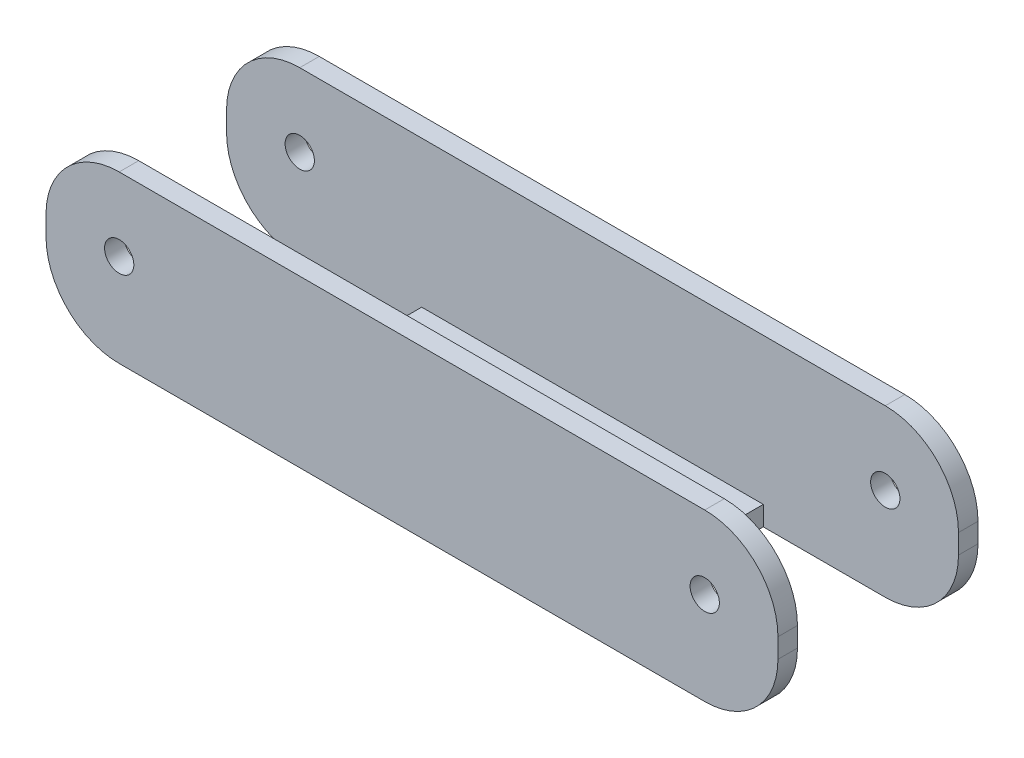
ISO-10303-21;
HEADER;
FILE_DESCRIPTION(('STEP AP214'),'2;1');
FILE_NAME('part.step','',(''),(''),'','','');
FILE_SCHEMA(('AUTOMOTIVE_DESIGN { 1 0 10303 214 1 1 1 1 }'));
ENDSEC;
DATA;
#1=APPLICATION_CONTEXT('core data for automotive mechanical design processes');
#2=APPLICATION_PROTOCOL_DEFINITION('international standard','automotive_design',2000,#1);
#3=PRODUCT_CONTEXT('',#1,'mechanical');
#4=PRODUCT('Part','Part','',(#3));
#5=PRODUCT_RELATED_PRODUCT_CATEGORY('part','',(#4));
#6=PRODUCT_DEFINITION_FORMATION('','',#4);
#7=PRODUCT_DEFINITION_CONTEXT('part definition',#1,'design');
#8=PRODUCT_DEFINITION('design','',#6,#7);
#9=PRODUCT_DEFINITION_SHAPE('','',#8);
#10=(LENGTH_UNIT() NAMED_UNIT(*) SI_UNIT(.MILLI.,.METRE.));
#11=(NAMED_UNIT(*) PLANE_ANGLE_UNIT() SI_UNIT($,.RADIAN.));
#12=(NAMED_UNIT(*) SI_UNIT($,.STERADIAN.) SOLID_ANGLE_UNIT());
#13=UNCERTAINTY_MEASURE_WITH_UNIT(LENGTH_MEASURE(1.E-05),#10,'distance_accuracy_value','');
#14=(GEOMETRIC_REPRESENTATION_CONTEXT(3) GLOBAL_UNCERTAINTY_ASSIGNED_CONTEXT((#13)) GLOBAL_UNIT_ASSIGNED_CONTEXT((#10,
#11,#12)) REPRESENTATION_CONTEXT('',''));
#15=CARTESIAN_POINT('',(0.,0.,0.));
#16=DIRECTION('',(0.,0.,1.));
#17=DIRECTION('',(1.,0.,0.));
#18=AXIS2_PLACEMENT_3D('',#15,#16,#17);
#19=CARTESIAN_POINT('',(0.,0.,0.));
#20=DIRECTION('',(1.,0.,0.));
#21=DIRECTION('',(0.,0.,-1.));
#22=AXIS2_PLACEMENT_3D('',#19,#20,#21);
#23=PLANE('',#22);
#24=DIRECTION('',(0.,-1.,0.));
#25=VECTOR('',#24,1.);
#26=CARTESIAN_POINT('',(0.,0.,-20.5));
#27=LINE('',#26,#25);
#28=CARTESIAN_POINT('',(0.,19.,-20.5));
#29=VERTEX_POINT('',#28);
#30=CARTESIAN_POINT('',(0.,15.,-20.5));
#31=VERTEX_POINT('',#30);
#32=EDGE_CURVE('E267',#29,#31,#27,.T.);
#33=ORIENTED_EDGE('',*,*,#32,.T.);
#34=DIRECTION('',(0.,0.,-1.));
#35=VECTOR('',#34,1.);
#36=CARTESIAN_POINT('',(0.,15.,0.));
#37=LINE('',#36,#35);
#38=CARTESIAN_POINT('',(0.,15.,-16.5));
#39=VERTEX_POINT('',#38);
#40=EDGE_CURVE('E356',#31,#39,#37,.F.);
#41=ORIENTED_EDGE('',*,*,#40,.T.);
#42=DIRECTION('',(0.,1.,0.));
#43=VECTOR('',#42,1.);
#44=CARTESIAN_POINT('',(0.,0.,-16.5));
#45=LINE('',#44,#43);
#46=CARTESIAN_POINT('',(0.,19.,-16.5));
#47=VERTEX_POINT('',#46);
#48=EDGE_CURVE('E253',#39,#47,#45,.T.);
#49=ORIENTED_EDGE('',*,*,#48,.T.);
#50=DIRECTION('',(0.,0.,-1.));
#51=VECTOR('',#50,1.);
#52=CARTESIAN_POINT('',(0.,19.,-20.5));
#53=LINE('',#52,#51);
#54=EDGE_CURVE('E353',#47,#29,#53,.T.);
#55=ORIENTED_EDGE('',*,*,#54,.T.);
#56=EDGE_LOOP('',(#33,#41,#49,#55));
#57=FACE_BOUND('',#56,.T.);
#58=ADVANCED_FACE('F39',(#57),#23,.F.);
#59=CARTESIAN_POINT('',(150.,0.,0.));
#60=DIRECTION('',(1.,0.,0.));
#61=DIRECTION('',(0.,0.,-1.));
#62=AXIS2_PLACEMENT_3D('',#59,#60,#61);
#63=PLANE('',#62);
#64=DIRECTION('',(0.,-1.,0.));
#65=VECTOR('',#64,1.);
#66=CARTESIAN_POINT('',(150.,0.,20.5));
#67=LINE('',#66,#65);
#68=CARTESIAN_POINT('',(150.,19.,20.5));
#69=VERTEX_POINT('',#68);
#70=CARTESIAN_POINT('',(150.,15.,20.5));
#71=VERTEX_POINT('',#70);
#72=EDGE_CURVE('E252',#69,#71,#67,.T.);
#73=ORIENTED_EDGE('',*,*,#72,.T.);
#74=DIRECTION('',(0.,0.,-1.));
#75=VECTOR('',#74,1.);
#76=CARTESIAN_POINT('',(150.,15.,16.5));
#77=LINE('',#76,#75);
#78=CARTESIAN_POINT('',(150.,15.,16.5));
#79=VERTEX_POINT('',#78);
#80=EDGE_CURVE('E297',#71,#79,#77,.T.);
#81=ORIENTED_EDGE('',*,*,#80,.T.);
#82=DIRECTION('',(0.,1.,0.));
#83=VECTOR('',#82,1.);
#84=CARTESIAN_POINT('',(150.,0.,16.5));
#85=LINE('',#84,#83);
#86=CARTESIAN_POINT('',(150.,19.,16.5));
#87=VERTEX_POINT('',#86);
#88=EDGE_CURVE('E249',#79,#87,#85,.T.);
#89=ORIENTED_EDGE('',*,*,#88,.T.);
#90=DIRECTION('',(0.,0.,1.));
#91=VECTOR('',#90,1.);
#92=CARTESIAN_POINT('',(150.,19.,20.5));
#93=LINE('',#92,#91);
#94=EDGE_CURVE('E290',#87,#69,#93,.T.);
#95=ORIENTED_EDGE('',*,*,#94,.T.);
#96=EDGE_LOOP('',(#73,#81,#89,#95));
#97=FACE_BOUND('',#96,.T.);
#98=ADVANCED_FACE('F380',(#97),#63,.T.);
#99=CARTESIAN_POINT('',(150.,4.,0.));
#100=DIRECTION('',(0.,-1.,0.));
#101=DIRECTION('',(0.,0.,-1.));
#102=AXIS2_PLACEMENT_3D('',#99,#100,#101);
#103=PLANE('',#102);
#104=DIRECTION('',(-1.,0.,0.));
#105=VECTOR('',#104,1.);
#106=CARTESIAN_POINT('',(150.,4.,-16.5));
#107=LINE('',#106,#105);
#108=CARTESIAN_POINT('',(110.,4.,-16.5));
#109=VERTEX_POINT('',#108);
#110=CARTESIAN_POINT('',(40.,4.,-16.5));
#111=VERTEX_POINT('',#110);
#112=EDGE_CURVE('E261',#109,#111,#107,.T.);
#113=ORIENTED_EDGE('',*,*,#112,.T.);
#114=DIRECTION('',(0.,0.,1.));
#115=VECTOR('',#114,1.);
#116=CARTESIAN_POINT('',(40.,4.,0.));
#117=LINE('',#116,#115);
#118=CARTESIAN_POINT('',(40.,3.99999999999999,16.5));
#119=VERTEX_POINT('',#118);
#120=EDGE_CURVE('E209',#111,#119,#117,.T.);
#121=ORIENTED_EDGE('',*,*,#120,.T.);
#122=DIRECTION('',(-1.,0.,0.));
#123=VECTOR('',#122,1.);
#124=CARTESIAN_POINT('',(150.,3.99999999999999,16.5));
#125=LINE('',#124,#123);
#126=CARTESIAN_POINT('',(110.,3.99999999999999,16.5));
#127=VERTEX_POINT('',#126);
#128=EDGE_CURVE('E186',#127,#119,#125,.T.);
#129=ORIENTED_EDGE('',*,*,#128,.F.);
#130=DIRECTION('',(0.,0.,-1.));
#131=VECTOR('',#130,1.);
#132=CARTESIAN_POINT('',(110.,4.,0.));
#133=LINE('',#132,#131);
#134=EDGE_CURVE('E223',#127,#109,#133,.T.);
#135=ORIENTED_EDGE('',*,*,#134,.T.);
#136=EDGE_LOOP('',(#113,#121,#129,#135));
#137=FACE_BOUND('',#136,.T.);
#138=ADVANCED_FACE('F408',(#137),#103,.F.);
#139=CARTESIAN_POINT('',(150.,0.,16.5));
#140=DIRECTION('',(0.,0.,1.));
#141=DIRECTION('',(0.,-1.,0.));
#142=AXIS2_PLACEMENT_3D('',#139,#140,#141);
#143=PLANE('',#142);
#144=ORIENTED_EDGE('',*,*,#88,.F.);
#145=CARTESIAN_POINT('',(135.,15.,16.5));
#146=DIRECTION('',(0.,0.,1.));
#147=DIRECTION('',(0.,-1.,0.));
#148=AXIS2_PLACEMENT_3D('',#145,#146,#147);
#149=CIRCLE('',#148,15.);
#150=CARTESIAN_POINT('',(135.,0.,16.5));
#151=VERTEX_POINT('',#150);
#152=EDGE_CURVE('E306',#79,#151,#149,.F.);
#153=ORIENTED_EDGE('',*,*,#152,.T.);
#154=DIRECTION('',(-1.,0.,0.));
#155=VECTOR('',#154,1.);
#156=CARTESIAN_POINT('',(110.,0.,16.5));
#157=LINE('',#156,#155);
#158=CARTESIAN_POINT('',(110.,0.,16.5));
#159=VERTEX_POINT('',#158);
#160=EDGE_CURVE('E212',#151,#159,#157,.T.);
#161=ORIENTED_EDGE('',*,*,#160,.T.);
#162=DIRECTION('',(0.,-1.,0.));
#163=VECTOR('',#162,1.);
#164=CARTESIAN_POINT('',(110.,10.,16.5));
#165=LINE('',#164,#163);
#166=EDGE_CURVE('E220',#127,#159,#165,.T.);
#167=ORIENTED_EDGE('',*,*,#166,.F.);
#168=ORIENTED_EDGE('',*,*,#128,.T.);
#169=DIRECTION('',(0.,-1.,0.));
#170=VECTOR('',#169,1.);
#171=CARTESIAN_POINT('',(40.,10.,16.5));
#172=LINE('',#171,#170);
#173=CARTESIAN_POINT('',(40.,0.,16.5));
#174=VERTEX_POINT('',#173);
#175=EDGE_CURVE('E177',#119,#174,#172,.T.);
#176=ORIENTED_EDGE('',*,*,#175,.T.);
#177=DIRECTION('',(-1.,0.,0.));
#178=VECTOR('',#177,1.);
#179=CARTESIAN_POINT('',(40.,0.,16.5));
#180=LINE('',#179,#178);
#181=CARTESIAN_POINT('',(15.,0.,16.5));
#182=VERTEX_POINT('',#181);
#183=EDGE_CURVE('E183',#174,#182,#180,.T.);
#184=ORIENTED_EDGE('',*,*,#183,.T.);
#185=CARTESIAN_POINT('',(15.,15.,16.5));
#186=DIRECTION('',(0.,0.,1.));
#187=DIRECTION('',(0.,-1.,0.));
#188=AXIS2_PLACEMENT_3D('',#185,#186,#187);
#189=CIRCLE('',#188,15.);
#190=CARTESIAN_POINT('',(0.,15.,16.5));
#191=VERTEX_POINT('',#190);
#192=EDGE_CURVE('E302',#182,#191,#189,.F.);
#193=ORIENTED_EDGE('',*,*,#192,.T.);
#194=DIRECTION('',(0.,1.,0.));
#195=VECTOR('',#194,1.);
#196=CARTESIAN_POINT('',(0.,0.,16.5));
#197=LINE('',#196,#195);
#198=CARTESIAN_POINT('',(0.,19.,16.5));
#199=VERTEX_POINT('',#198);
#200=EDGE_CURVE('E248',#191,#199,#197,.T.);
#201=ORIENTED_EDGE('',*,*,#200,.T.);
#202=CARTESIAN_POINT('',(15.,19.,16.5));
#203=DIRECTION('',(0.,0.,1.));
#204=DIRECTION('',(0.,-1.,0.));
#205=AXIS2_PLACEMENT_3D('',#202,#203,#204);
#206=CIRCLE('',#205,15.);
#207=CARTESIAN_POINT('',(15.,34.,16.5));
#208=VERTEX_POINT('',#207);
#209=EDGE_CURVE('E300',#199,#208,#206,.F.);
#210=ORIENTED_EDGE('',*,*,#209,.T.);
#211=DIRECTION('',(-1.,0.,0.));
#212=VECTOR('',#211,1.);
#213=CARTESIAN_POINT('',(150.,34.,16.5));
#214=LINE('',#213,#212);
#215=CARTESIAN_POINT('',(135.,34.,16.5));
#216=VERTEX_POINT('',#215);
#217=EDGE_CURVE('E286',#216,#208,#214,.T.);
#218=ORIENTED_EDGE('',*,*,#217,.F.);
#219=CARTESIAN_POINT('',(135.,19.,16.5));
#220=DIRECTION('',(0.,0.,1.));
#221=DIRECTION('',(0.,-1.,0.));
#222=AXIS2_PLACEMENT_3D('',#219,#220,#221);
#223=CIRCLE('',#222,15.);
#224=EDGE_CURVE('E304',#216,#87,#223,.F.);
#225=ORIENTED_EDGE('',*,*,#224,.T.);
#226=EDGE_LOOP('',(#144,#153,#161,#167,#168,#176,#184,#193,#201,#210,#218,#225));
#227=FACE_BOUND('',#226,.T.);
#228=CARTESIAN_POINT('',(135.,19.,16.5));
#229=DIRECTION('',(0.,0.,1.));
#230=DIRECTION('',(0.,-1.,0.));
#231=AXIS2_PLACEMENT_3D('',#228,#229,#230);
#232=CIRCLE('',#231,2.99999999999999);
#233=CARTESIAN_POINT('',(135.,16.,16.5));
#234=VERTEX_POINT('',#233);
#235=EDGE_CURVE('E235',#234,#234,#232,.T.);
#236=ORIENTED_EDGE('',*,*,#235,.T.);
#237=EDGE_LOOP('',(#236));
#238=FACE_BOUND('',#237,.T.);
#239=CARTESIAN_POINT('',(15.,19.,16.5));
#240=DIRECTION('',(0.,0.,1.));
#241=DIRECTION('',(0.,-1.,0.));
#242=AXIS2_PLACEMENT_3D('',#239,#240,#241);
#243=CIRCLE('',#242,2.99999999999999);
#244=CARTESIAN_POINT('',(15.,16.,16.5));
#245=VERTEX_POINT('',#244);
#246=EDGE_CURVE('E245',#245,#245,#243,.T.);
#247=ORIENTED_EDGE('',*,*,#246,.T.);
#248=EDGE_LOOP('',(#247));
#249=FACE_BOUND('',#248,.T.);
#250=ADVANCED_FACE('F180',(#227,#238,#249),#143,.F.);
#251=CARTESIAN_POINT('',(150.,34.,0.));
#252=DIRECTION('',(0.,-1.,0.));
#253=DIRECTION('',(0.,0.,-1.));
#254=AXIS2_PLACEMENT_3D('',#251,#252,#253);
#255=PLANE('',#254);
#256=DIRECTION('',(-1.,0.,0.));
#257=VECTOR('',#256,1.);
#258=CARTESIAN_POINT('',(150.,34.,20.5));
#259=LINE('',#258,#257);
#260=CARTESIAN_POINT('',(135.,34.,20.5));
#261=VERTEX_POINT('',#260);
#262=CARTESIAN_POINT('',(15.,34.,20.5));
#263=VERTEX_POINT('',#262);
#264=EDGE_CURVE('E283',#261,#263,#259,.T.);
#265=ORIENTED_EDGE('',*,*,#264,.F.);
#266=DIRECTION('',(0.,0.,1.));
#267=VECTOR('',#266,1.);
#268=CARTESIAN_POINT('',(135.,34.,16.5));
#269=LINE('',#268,#267);
#270=EDGE_CURVE('E351',#261,#216,#269,.F.);
#271=ORIENTED_EDGE('',*,*,#270,.T.);
#272=ORIENTED_EDGE('',*,*,#217,.T.);
#273=DIRECTION('',(0.,0.,1.));
#274=VECTOR('',#273,1.);
#275=CARTESIAN_POINT('',(15.,34.,0.));
#276=LINE('',#275,#274);
#277=EDGE_CURVE('E348',#208,#263,#276,.T.);
#278=ORIENTED_EDGE('',*,*,#277,.T.);
#279=EDGE_LOOP('',(#265,#271,#272,#278));
#280=FACE_BOUND('',#279,.T.);
#281=ADVANCED_FACE('F369',(#280),#255,.F.);
#282=CARTESIAN_POINT('',(150.,0.,20.5));
#283=DIRECTION('',(0.,0.,-1.));
#284=DIRECTION('',(0.,1.,0.));
#285=AXIS2_PLACEMENT_3D('',#282,#283,#284);
#286=PLANE('',#285);
#287=CARTESIAN_POINT('',(135.,19.,20.5));
#288=DIRECTION('',(0.,0.,1.));
#289=DIRECTION('',(-1.,0.,0.));
#290=AXIS2_PLACEMENT_3D('',#287,#288,#289);
#291=CIRCLE('',#290,2.99999999999999);
#292=CARTESIAN_POINT('',(132.,19.,20.5));
#293=VERTEX_POINT('',#292);
#294=EDGE_CURVE('E228',#293,#293,#291,.T.);
#295=ORIENTED_EDGE('',*,*,#294,.F.);
#296=EDGE_LOOP('',(#295));
#297=FACE_BOUND('',#296,.T.);
#298=CARTESIAN_POINT('',(15.,19.,20.5));
#299=DIRECTION('',(0.,0.,1.));
#300=DIRECTION('',(1.,0.,0.));
#301=AXIS2_PLACEMENT_3D('',#298,#299,#300);
#302=CIRCLE('',#301,2.99999999999999);
#303=CARTESIAN_POINT('',(18.,19.,20.5));
#304=VERTEX_POINT('',#303);
#305=EDGE_CURVE('E238',#304,#304,#302,.T.);
#306=ORIENTED_EDGE('',*,*,#305,.F.);
#307=EDGE_LOOP('',(#306));
#308=FACE_BOUND('',#307,.T.);
#309=DIRECTION('',(-1.,0.,0.));
#310=VECTOR('',#309,1.);
#311=CARTESIAN_POINT('',(150.,0.,20.5));
#312=LINE('',#311,#310);
#313=CARTESIAN_POINT('',(135.,0.,20.5));
#314=VERTEX_POINT('',#313);
#315=CARTESIAN_POINT('',(15.,0.,20.5));
#316=VERTEX_POINT('',#315);
#317=EDGE_CURVE('E281',#314,#316,#312,.T.);
#318=ORIENTED_EDGE('',*,*,#317,.F.);
#319=CARTESIAN_POINT('',(135.,15.,20.5));
#320=DIRECTION('',(0.,0.,-1.));
#321=DIRECTION('',(0.,1.,0.));
#322=AXIS2_PLACEMENT_3D('',#319,#320,#321);
#323=CIRCLE('',#322,15.);
#324=EDGE_CURVE('E322',#314,#71,#323,.F.);
#325=ORIENTED_EDGE('',*,*,#324,.T.);
#326=ORIENTED_EDGE('',*,*,#72,.F.);
#327=CARTESIAN_POINT('',(135.,19.,20.5));
#328=DIRECTION('',(0.,0.,-1.));
#329=DIRECTION('',(0.,1.,0.));
#330=AXIS2_PLACEMENT_3D('',#327,#328,#329);
#331=CIRCLE('',#330,15.);
#332=EDGE_CURVE('E320',#69,#261,#331,.F.);
#333=ORIENTED_EDGE('',*,*,#332,.T.);
#334=ORIENTED_EDGE('',*,*,#264,.T.);
#335=CARTESIAN_POINT('',(15.,19.,20.5));
#336=DIRECTION('',(0.,0.,-1.));
#337=DIRECTION('',(0.,1.,0.));
#338=AXIS2_PLACEMENT_3D('',#335,#336,#337);
#339=CIRCLE('',#338,15.);
#340=CARTESIAN_POINT('',(0.,19.,20.5));
#341=VERTEX_POINT('',#340);
#342=EDGE_CURVE('E316',#263,#341,#339,.F.);
#343=ORIENTED_EDGE('',*,*,#342,.T.);
#344=DIRECTION('',(0.,-1.,0.));
#345=VECTOR('',#344,1.);
#346=CARTESIAN_POINT('',(0.,0.,20.5));
#347=LINE('',#346,#345);
#348=CARTESIAN_POINT('',(0.,15.,20.5));
#349=VERTEX_POINT('',#348);
#350=EDGE_CURVE('E264',#341,#349,#347,.T.);
#351=ORIENTED_EDGE('',*,*,#350,.T.);
#352=CARTESIAN_POINT('',(15.,15.,20.5));
#353=DIRECTION('',(0.,0.,-1.));
#354=DIRECTION('',(0.,1.,0.));
#355=AXIS2_PLACEMENT_3D('',#352,#353,#354);
#356=CIRCLE('',#355,15.);
#357=EDGE_CURVE('E318',#349,#316,#356,.F.);
#358=ORIENTED_EDGE('',*,*,#357,.T.);
#359=EDGE_LOOP('',(#318,#325,#326,#333,#334,#343,#351,#358));
#360=FACE_BOUND('',#359,.T.);
#361=ADVANCED_FACE('F373',(#297,#308,#360),#286,.F.);
#362=CARTESIAN_POINT('',(150.,0.,0.));
#363=DIRECTION('',(0.,1.,0.));
#364=DIRECTION('',(0.,0.,1.));
#365=AXIS2_PLACEMENT_3D('',#362,#363,#364);
#366=PLANE('',#365);
#367=ORIENTED_EDGE('',*,*,#160,.F.);
#368=DIRECTION('',(0.,0.,-1.));
#369=VECTOR('',#368,1.);
#370=CARTESIAN_POINT('',(135.,0.,20.5));
#371=LINE('',#370,#369);
#372=EDGE_CURVE('E314',#151,#314,#371,.F.);
#373=ORIENTED_EDGE('',*,*,#372,.T.);
#374=ORIENTED_EDGE('',*,*,#317,.T.);
#375=DIRECTION('',(0.,0.,-1.));
#376=VECTOR('',#375,1.);
#377=CARTESIAN_POINT('',(15.,0.,0.));
#378=LINE('',#377,#376);
#379=EDGE_CURVE('E205',#316,#182,#378,.T.);
#380=ORIENTED_EDGE('',*,*,#379,.T.);
#381=ORIENTED_EDGE('',*,*,#183,.F.);
#382=DIRECTION('',(0.,0.,1.));
#383=VECTOR('',#382,1.);
#384=CARTESIAN_POINT('',(40.,0.,-16.5));
#385=LINE('',#384,#383);
#386=CARTESIAN_POINT('',(40.,0.,-16.5));
#387=VERTEX_POINT('',#386);
#388=EDGE_CURVE('E194',#387,#174,#385,.T.);
#389=ORIENTED_EDGE('',*,*,#388,.F.);
#390=DIRECTION('',(1.,0.,0.));
#391=VECTOR('',#390,1.);
#392=CARTESIAN_POINT('',(0.,0.,-16.5));
#393=LINE('',#392,#391);
#394=CARTESIAN_POINT('',(15.,0.,-16.5));
#395=VERTEX_POINT('',#394);
#396=EDGE_CURVE('E190',#395,#387,#393,.T.);
#397=ORIENTED_EDGE('',*,*,#396,.F.);
#398=DIRECTION('',(0.,0.,-1.));
#399=VECTOR('',#398,1.);
#400=CARTESIAN_POINT('',(15.,0.,0.));
#401=LINE('',#400,#399);
#402=CARTESIAN_POINT('',(15.,0.,-20.5));
#403=VERTEX_POINT('',#402);
#404=EDGE_CURVE('E309',#395,#403,#401,.T.);
#405=ORIENTED_EDGE('',*,*,#404,.T.);
#406=DIRECTION('',(-1.,0.,0.));
#407=VECTOR('',#406,1.);
#408=CARTESIAN_POINT('',(150.,0.,-20.5));
#409=LINE('',#408,#407);
#410=CARTESIAN_POINT('',(135.,0.,-20.5));
#411=VERTEX_POINT('',#410);
#412=EDGE_CURVE('E278',#411,#403,#409,.T.);
#413=ORIENTED_EDGE('',*,*,#412,.F.);
#414=DIRECTION('',(0.,0.,-1.));
#415=VECTOR('',#414,1.);
#416=CARTESIAN_POINT('',(135.,0.,-16.5));
#417=LINE('',#416,#415);
#418=CARTESIAN_POINT('',(135.,0.,-16.5));
#419=VERTEX_POINT('',#418);
#420=EDGE_CURVE('E312',#411,#419,#417,.F.);
#421=ORIENTED_EDGE('',*,*,#420,.T.);
#422=DIRECTION('',(1.,0.,0.));
#423=VECTOR('',#422,1.);
#424=CARTESIAN_POINT('',(150.,0.,-16.5));
#425=LINE('',#424,#423);
#426=CARTESIAN_POINT('',(110.,0.,-16.5));
#427=VERTEX_POINT('',#426);
#428=EDGE_CURVE('E217',#427,#419,#425,.T.);
#429=ORIENTED_EDGE('',*,*,#428,.F.);
#430=DIRECTION('',(0.,0.,-1.));
#431=VECTOR('',#430,1.);
#432=CARTESIAN_POINT('',(110.,0.,-16.5));
#433=LINE('',#432,#431);
#434=EDGE_CURVE('E214',#159,#427,#433,.T.);
#435=ORIENTED_EDGE('',*,*,#434,.F.);
#436=EDGE_LOOP('',(#367,#373,#374,#380,#381,#389,#397,#405,#413,#421,#429,#435));
#437=FACE_BOUND('',#436,.T.);
#438=ADVANCED_FACE('F202',(#437),#366,.F.);
#439=CARTESIAN_POINT('',(150.,0.,-20.5));
#440=DIRECTION('',(0.,0.,-1.));
#441=DIRECTION('',(0.,1.,0.));
#442=AXIS2_PLACEMENT_3D('',#439,#440,#441);
#443=PLANE('',#442);
#444=CARTESIAN_POINT('',(135.,19.,-20.5));
#445=DIRECTION('',(0.,0.,-1.));
#446=DIRECTION('',(0.,1.,0.));
#447=AXIS2_PLACEMENT_3D('',#444,#445,#446);
#448=CIRCLE('',#447,2.99999999999999);
#449=CARTESIAN_POINT('',(135.,22.,-20.5));
#450=VERTEX_POINT('',#449);
#451=EDGE_CURVE('E232',#450,#450,#448,.T.);
#452=ORIENTED_EDGE('',*,*,#451,.F.);
#453=EDGE_LOOP('',(#452));
#454=FACE_BOUND('',#453,.T.);
#455=CARTESIAN_POINT('',(15.,19.,-20.5));
#456=DIRECTION('',(0.,0.,-1.));
#457=DIRECTION('',(0.,1.,0.));
#458=AXIS2_PLACEMENT_3D('',#455,#456,#457);
#459=CIRCLE('',#458,2.99999999999999);
#460=CARTESIAN_POINT('',(15.,22.,-20.5));
#461=VERTEX_POINT('',#460);
#462=EDGE_CURVE('E242',#461,#461,#459,.T.);
#463=ORIENTED_EDGE('',*,*,#462,.F.);
#464=EDGE_LOOP('',(#463));
#465=FACE_BOUND('',#464,.T.);
#466=DIRECTION('',(0.,-1.,0.));
#467=VECTOR('',#466,1.);
#468=CARTESIAN_POINT('',(150.,0.,-20.5));
#469=LINE('',#468,#467);
#470=CARTESIAN_POINT('',(150.,19.,-20.5));
#471=VERTEX_POINT('',#470);
#472=CARTESIAN_POINT('',(150.,15.,-20.5));
#473=VERTEX_POINT('',#472);
#474=EDGE_CURVE('E256',#471,#473,#469,.T.);
#475=ORIENTED_EDGE('',*,*,#474,.T.);
#476=CARTESIAN_POINT('',(135.,15.,-20.5));
#477=DIRECTION('',(0.,0.,-1.));
#478=DIRECTION('',(0.,1.,0.));
#479=AXIS2_PLACEMENT_3D('',#476,#477,#478);
#480=CIRCLE('',#479,15.);
#481=EDGE_CURVE('E335',#473,#411,#480,.T.);
#482=ORIENTED_EDGE('',*,*,#481,.T.);
#483=ORIENTED_EDGE('',*,*,#412,.T.);
#484=CARTESIAN_POINT('',(15.,15.,-20.5));
#485=DIRECTION('',(0.,0.,-1.));
#486=DIRECTION('',(0.,1.,0.));
#487=AXIS2_PLACEMENT_3D('',#484,#485,#486);
#488=CIRCLE('',#487,15.);
#489=EDGE_CURVE('E331',#403,#31,#488,.T.);
#490=ORIENTED_EDGE('',*,*,#489,.T.);
#491=ORIENTED_EDGE('',*,*,#32,.F.);
#492=CARTESIAN_POINT('',(15.,19.,-20.5));
#493=DIRECTION('',(0.,0.,-1.));
#494=DIRECTION('',(0.,1.,0.));
#495=AXIS2_PLACEMENT_3D('',#492,#493,#494);
#496=CIRCLE('',#495,15.);
#497=CARTESIAN_POINT('',(15.,34.,-20.5));
#498=VERTEX_POINT('',#497);
#499=EDGE_CURVE('E329',#29,#498,#496,.T.);
#500=ORIENTED_EDGE('',*,*,#499,.T.);
#501=DIRECTION('',(-1.,0.,0.));
#502=VECTOR('',#501,1.);
#503=CARTESIAN_POINT('',(150.,34.,-20.5));
#504=LINE('',#503,#502);
#505=CARTESIAN_POINT('',(135.,34.,-20.5));
#506=VERTEX_POINT('',#505);
#507=EDGE_CURVE('E276',#506,#498,#504,.T.);
#508=ORIENTED_EDGE('',*,*,#507,.F.);
#509=CARTESIAN_POINT('',(135.,19.,-20.5));
#510=DIRECTION('',(0.,0.,-1.));
#511=DIRECTION('',(0.,1.,0.));
#512=AXIS2_PLACEMENT_3D('',#509,#510,#511);
#513=CIRCLE('',#512,15.);
#514=EDGE_CURVE('E333',#506,#471,#513,.T.);
#515=ORIENTED_EDGE('',*,*,#514,.T.);
#516=EDGE_LOOP('',(#475,#482,#483,#490,#491,#500,#508,#515));
#517=FACE_BOUND('',#516,.T.);
#518=ADVANCED_FACE('F613',(#454,#465,#517),#443,.T.);
#519=CARTESIAN_POINT('',(150.,34.,0.));
#520=DIRECTION('',(0.,1.,0.));
#521=DIRECTION('',(0.,0.,1.));
#522=AXIS2_PLACEMENT_3D('',#519,#520,#521);
#523=PLANE('',#522);
#524=DIRECTION('',(-1.,0.,0.));
#525=VECTOR('',#524,1.);
#526=CARTESIAN_POINT('',(150.,34.,-16.5));
#527=LINE('',#526,#525);
#528=CARTESIAN_POINT('',(135.,34.,-16.5));
#529=VERTEX_POINT('',#528);
#530=CARTESIAN_POINT('',(15.,34.,-16.5));
#531=VERTEX_POINT('',#530);
#532=EDGE_CURVE('E274',#529,#531,#527,.T.);
#533=ORIENTED_EDGE('',*,*,#532,.F.);
#534=DIRECTION('',(0.,0.,-1.));
#535=VECTOR('',#534,1.);
#536=CARTESIAN_POINT('',(135.,34.,0.));
#537=LINE('',#536,#535);
#538=EDGE_CURVE('E345',#529,#506,#537,.T.);
#539=ORIENTED_EDGE('',*,*,#538,.T.);
#540=ORIENTED_EDGE('',*,*,#507,.T.);
#541=DIRECTION('',(0.,0.,-1.));
#542=VECTOR('',#541,1.);
#543=CARTESIAN_POINT('',(15.,34.,-16.5));
#544=LINE('',#543,#542);
#545=EDGE_CURVE('E54',#498,#531,#544,.F.);
#546=ORIENTED_EDGE('',*,*,#545,.T.);
#547=EDGE_LOOP('',(#533,#539,#540,#546));
#548=FACE_BOUND('',#547,.T.);
#549=ADVANCED_FACE('F426',(#548),#523,.T.);
#550=CARTESIAN_POINT('',(150.,0.,-16.5));
#551=DIRECTION('',(0.,0.,1.));
#552=DIRECTION('',(0.,-1.,0.));
#553=AXIS2_PLACEMENT_3D('',#550,#551,#552);
#554=PLANE('',#553);
#555=ORIENTED_EDGE('',*,*,#428,.T.);
#556=CARTESIAN_POINT('',(135.,15.,-16.5));
#557=DIRECTION('',(0.,0.,1.));
#558=DIRECTION('',(0.,-1.,0.));
#559=AXIS2_PLACEMENT_3D('',#556,#557,#558);
#560=CIRCLE('',#559,15.);
#561=CARTESIAN_POINT('',(150.,15.,-16.5));
#562=VERTEX_POINT('',#561);
#563=EDGE_CURVE('E342',#419,#562,#560,.T.);
#564=ORIENTED_EDGE('',*,*,#563,.T.);
#565=DIRECTION('',(0.,1.,0.));
#566=VECTOR('',#565,1.);
#567=CARTESIAN_POINT('',(150.,0.,-16.5));
#568=LINE('',#567,#566);
#569=CARTESIAN_POINT('',(150.,19.,-16.5));
#570=VERTEX_POINT('',#569);
#571=EDGE_CURVE('E259',#562,#570,#568,.T.);
#572=ORIENTED_EDGE('',*,*,#571,.T.);
#573=CARTESIAN_POINT('',(135.,19.,-16.5));
#574=DIRECTION('',(0.,0.,1.));
#575=DIRECTION('',(0.,-1.,0.));
#576=AXIS2_PLACEMENT_3D('',#573,#574,#575);
#577=CIRCLE('',#576,15.);
#578=EDGE_CURVE('E61',#570,#529,#577,.T.);
#579=ORIENTED_EDGE('',*,*,#578,.T.);
#580=ORIENTED_EDGE('',*,*,#532,.T.);
#581=CARTESIAN_POINT('',(15.,19.,-16.5));
#582=DIRECTION('',(0.,0.,1.));
#583=DIRECTION('',(0.,-1.,0.));
#584=AXIS2_PLACEMENT_3D('',#581,#582,#583);
#585=CIRCLE('',#584,15.);
#586=EDGE_CURVE('E337',#531,#47,#585,.T.);
#587=ORIENTED_EDGE('',*,*,#586,.T.);
#588=ORIENTED_EDGE('',*,*,#48,.F.);
#589=CARTESIAN_POINT('',(15.,15.,-16.5));
#590=DIRECTION('',(0.,0.,1.));
#591=DIRECTION('',(0.,-1.,0.));
#592=AXIS2_PLACEMENT_3D('',#589,#590,#591);
#593=CIRCLE('',#592,15.);
#594=EDGE_CURVE('E339',#39,#395,#593,.T.);
#595=ORIENTED_EDGE('',*,*,#594,.T.);
#596=ORIENTED_EDGE('',*,*,#396,.T.);
#597=DIRECTION('',(0.,-1.,0.));
#598=VECTOR('',#597,1.);
#599=CARTESIAN_POINT('',(40.,10.,-16.5));
#600=LINE('',#599,#598);
#601=EDGE_CURVE('E189',#111,#387,#600,.T.);
#602=ORIENTED_EDGE('',*,*,#601,.F.);
#603=ORIENTED_EDGE('',*,*,#112,.F.);
#604=DIRECTION('',(0.,-1.,0.));
#605=VECTOR('',#604,1.);
#606=CARTESIAN_POINT('',(110.,10.,-16.5));
#607=LINE('',#606,#605);
#608=EDGE_CURVE('E221',#109,#427,#607,.T.);
#609=ORIENTED_EDGE('',*,*,#608,.T.);
#610=EDGE_LOOP('',(#555,#564,#572,#579,#580,#587,#588,#595,#596,#602,#603,#609));
#611=FACE_BOUND('',#610,.T.);
#612=CARTESIAN_POINT('',(135.,19.,-16.5));
#613=DIRECTION('',(0.,0.,1.));
#614=DIRECTION('',(0.,-1.,0.));
#615=AXIS2_PLACEMENT_3D('',#612,#613,#614);
#616=CIRCLE('',#615,2.99999999999999);
#617=CARTESIAN_POINT('',(135.,16.,-16.5));
#618=VERTEX_POINT('',#617);
#619=EDGE_CURVE('E231',#618,#618,#616,.T.);
#620=ORIENTED_EDGE('',*,*,#619,.F.);
#621=EDGE_LOOP('',(#620));
#622=FACE_BOUND('',#621,.T.);
#623=CARTESIAN_POINT('',(15.,19.,-16.5));
#624=DIRECTION('',(0.,0.,1.));
#625=DIRECTION('',(0.,-1.,0.));
#626=AXIS2_PLACEMENT_3D('',#623,#624,#625);
#627=CIRCLE('',#626,2.99999999999999);
#628=CARTESIAN_POINT('',(15.,16.,-16.5));
#629=VERTEX_POINT('',#628);
#630=EDGE_CURVE('E241',#629,#629,#627,.T.);
#631=ORIENTED_EDGE('',*,*,#630,.F.);
#632=EDGE_LOOP('',(#631));
#633=FACE_BOUND('',#632,.T.);
#634=ADVANCED_FACE('F421',(#611,#622,#633),#554,.T.);
#635=ORIENTED_EDGE('',*,*,#571,.F.);
#636=DIRECTION('',(0.,0.,-1.));
#637=VECTOR('',#636,1.);
#638=CARTESIAN_POINT('',(150.,15.,-20.5));
#639=LINE('',#638,#637);
#640=EDGE_CURVE('E326',#562,#473,#639,.T.);
#641=ORIENTED_EDGE('',*,*,#640,.T.);
#642=ORIENTED_EDGE('',*,*,#474,.F.);
#643=DIRECTION('',(0.,0.,-1.));
#644=VECTOR('',#643,1.);
#645=CARTESIAN_POINT('',(150.,19.,0.));
#646=LINE('',#645,#644);
#647=EDGE_CURVE('E324',#471,#570,#646,.F.);
#648=ORIENTED_EDGE('',*,*,#647,.T.);
#649=EDGE_LOOP('',(#635,#641,#642,#648));
#650=FACE_BOUND('',#649,.T.);
#651=ADVANCED_FACE('F410',(#650),#63,.T.);
#652=ORIENTED_EDGE('',*,*,#200,.F.);
#653=DIRECTION('',(0.,0.,-1.));
#654=VECTOR('',#653,1.);
#655=CARTESIAN_POINT('',(0.,15.,0.));
#656=LINE('',#655,#654);
#657=EDGE_CURVE('E11',#191,#349,#656,.F.);
#658=ORIENTED_EDGE('',*,*,#657,.T.);
#659=ORIENTED_EDGE('',*,*,#350,.F.);
#660=DIRECTION('',(0.,0.,1.));
#661=VECTOR('',#660,1.);
#662=CARTESIAN_POINT('',(0.,19.,0.));
#663=LINE('',#662,#661);
#664=EDGE_CURVE('E47',#341,#199,#663,.F.);
#665=ORIENTED_EDGE('',*,*,#664,.T.);
#666=EDGE_LOOP('',(#652,#658,#659,#665));
#667=FACE_BOUND('',#666,.T.);
#668=ADVANCED_FACE('F361',(#667),#23,.F.);
#669=CARTESIAN_POINT('',(15.,19.,-279.5));
#670=DIRECTION('',(0.,0.,1.));
#671=DIRECTION('',(1.,0.,0.));
#672=AXIS2_PLACEMENT_3D('',#669,#670,#671);
#673=CYLINDRICAL_SURFACE('',#672,2.99999999999999);
#674=ORIENTED_EDGE('',*,*,#462,.T.);
#675=EDGE_LOOP('',(#674));
#676=FACE_BOUND('',#675,.T.);
#677=ORIENTED_EDGE('',*,*,#630,.T.);
#678=EDGE_LOOP('',(#677));
#679=FACE_BOUND('',#678,.T.);
#680=ADVANCED_FACE('F413',(#676,#679),#673,.F.);
#681=ORIENTED_EDGE('',*,*,#305,.T.);
#682=EDGE_LOOP('',(#681));
#683=FACE_BOUND('',#682,.T.);
#684=ORIENTED_EDGE('',*,*,#246,.F.);
#685=EDGE_LOOP('',(#684));
#686=FACE_BOUND('',#685,.T.);
#687=ADVANCED_FACE('F418',(#683,#686),#673,.F.);
#688=CARTESIAN_POINT('',(135.,19.,-279.5));
#689=DIRECTION('',(0.,0.,1.));
#690=DIRECTION('',(1.,0.,0.));
#691=AXIS2_PLACEMENT_3D('',#688,#689,#690);
#692=CYLINDRICAL_SURFACE('',#691,2.99999999999999);
#693=ORIENTED_EDGE('',*,*,#451,.T.);
#694=EDGE_LOOP('',(#693));
#695=FACE_BOUND('',#694,.T.);
#696=ORIENTED_EDGE('',*,*,#619,.T.);
#697=EDGE_LOOP('',(#696));
#698=FACE_BOUND('',#697,.T.);
#699=ADVANCED_FACE('F429',(#695,#698),#692,.F.);
#700=ORIENTED_EDGE('',*,*,#294,.T.);
#701=EDGE_LOOP('',(#700));
#702=FACE_BOUND('',#701,.T.);
#703=ORIENTED_EDGE('',*,*,#235,.F.);
#704=EDGE_LOOP('',(#703));
#705=FACE_BOUND('',#704,.T.);
#706=ADVANCED_FACE('F432',(#702,#705),#692,.F.);
#707=CARTESIAN_POINT('',(110.,10.,-16.5));
#708=DIRECTION('',(-1.,0.,0.));
#709=DIRECTION('',(0.,0.,1.));
#710=AXIS2_PLACEMENT_3D('',#707,#708,#709);
#711=PLANE('',#710);
#712=ORIENTED_EDGE('',*,*,#166,.T.);
#713=ORIENTED_EDGE('',*,*,#434,.T.);
#714=ORIENTED_EDGE('',*,*,#608,.F.);
#715=ORIENTED_EDGE('',*,*,#134,.F.);
#716=EDGE_LOOP('',(#712,#713,#714,#715));
#717=FACE_BOUND('',#716,.T.);
#718=ADVANCED_FACE('F434',(#717),#711,.F.);
#719=CARTESIAN_POINT('',(40.,10.,-16.5));
#720=DIRECTION('',(1.,0.,0.));
#721=DIRECTION('',(0.,0.,-1.));
#722=AXIS2_PLACEMENT_3D('',#719,#720,#721);
#723=PLANE('',#722);
#724=ORIENTED_EDGE('',*,*,#601,.T.);
#725=ORIENTED_EDGE('',*,*,#388,.T.);
#726=ORIENTED_EDGE('',*,*,#175,.F.);
#727=ORIENTED_EDGE('',*,*,#120,.F.);
#728=EDGE_LOOP('',(#724,#725,#726,#727));
#729=FACE_BOUND('',#728,.T.);
#730=ADVANCED_FACE('F195',(#729),#723,.F.);
#731=CARTESIAN_POINT('',(135.,15.,0.));
#732=DIRECTION('',(0.,0.,1.));
#733=DIRECTION('',(0.,-1.,0.));
#734=AXIS2_PLACEMENT_3D('',#731,#732,#733);
#735=CYLINDRICAL_SURFACE('',#734,15.);
#736=ORIENTED_EDGE('',*,*,#324,.F.);
#737=ORIENTED_EDGE('',*,*,#372,.F.);
#738=ORIENTED_EDGE('',*,*,#152,.F.);
#739=ORIENTED_EDGE('',*,*,#80,.F.);
#740=EDGE_LOOP('',(#736,#737,#738,#739));
#741=FACE_BOUND('',#740,.T.);
#742=ADVANCED_FACE('F387',(#741),#735,.T.);
#743=CARTESIAN_POINT('',(135.,15.,0.));
#744=DIRECTION('',(0.,0.,1.));
#745=DIRECTION('',(0.,-1.,0.));
#746=AXIS2_PLACEMENT_3D('',#743,#744,#745);
#747=CYLINDRICAL_SURFACE('',#746,15.);
#748=ORIENTED_EDGE('',*,*,#563,.F.);
#749=ORIENTED_EDGE('',*,*,#420,.F.);
#750=ORIENTED_EDGE('',*,*,#481,.F.);
#751=ORIENTED_EDGE('',*,*,#640,.F.);
#752=EDGE_LOOP('',(#748,#749,#750,#751));
#753=FACE_BOUND('',#752,.T.);
#754=ADVANCED_FACE('F442',(#753),#747,.T.);
#755=CARTESIAN_POINT('',(135.,19.,0.));
#756=DIRECTION('',(0.,0.,-1.));
#757=DIRECTION('',(-1.,0.,0.));
#758=AXIS2_PLACEMENT_3D('',#755,#756,#757);
#759=CYLINDRICAL_SURFACE('',#758,15.);
#760=ORIENTED_EDGE('',*,*,#578,.F.);
#761=ORIENTED_EDGE('',*,*,#647,.F.);
#762=ORIENTED_EDGE('',*,*,#514,.F.);
#763=ORIENTED_EDGE('',*,*,#538,.F.);
#764=EDGE_LOOP('',(#760,#761,#762,#763));
#765=FACE_BOUND('',#764,.T.);
#766=ADVANCED_FACE('F447',(#765),#759,.T.);
#767=CARTESIAN_POINT('',(135.,19.,0.));
#768=DIRECTION('',(0.,0.,-1.));
#769=DIRECTION('',(-1.,0.,0.));
#770=AXIS2_PLACEMENT_3D('',#767,#768,#769);
#771=CYLINDRICAL_SURFACE('',#770,15.);
#772=ORIENTED_EDGE('',*,*,#224,.F.);
#773=ORIENTED_EDGE('',*,*,#270,.F.);
#774=ORIENTED_EDGE('',*,*,#332,.F.);
#775=ORIENTED_EDGE('',*,*,#94,.F.);
#776=EDGE_LOOP('',(#772,#773,#774,#775));
#777=FACE_BOUND('',#776,.T.);
#778=ADVANCED_FACE('F378',(#777),#771,.T.);
#779=CARTESIAN_POINT('',(15.,15.,0.));
#780=DIRECTION('',(0.,0.,-1.));
#781=DIRECTION('',(0.,1.,0.));
#782=AXIS2_PLACEMENT_3D('',#779,#780,#781);
#783=CYLINDRICAL_SURFACE('',#782,15.);
#784=ORIENTED_EDGE('',*,*,#594,.F.);
#785=ORIENTED_EDGE('',*,*,#40,.F.);
#786=ORIENTED_EDGE('',*,*,#489,.F.);
#787=ORIENTED_EDGE('',*,*,#404,.F.);
#788=EDGE_LOOP('',(#784,#785,#786,#787));
#789=FACE_BOUND('',#788,.T.);
#790=ADVANCED_FACE('F393',(#789),#783,.T.);
#791=CARTESIAN_POINT('',(15.,15.,0.));
#792=DIRECTION('',(0.,0.,-1.));
#793=DIRECTION('',(0.,1.,0.));
#794=AXIS2_PLACEMENT_3D('',#791,#792,#793);
#795=CYLINDRICAL_SURFACE('',#794,15.);
#796=ORIENTED_EDGE('',*,*,#357,.F.);
#797=ORIENTED_EDGE('',*,*,#657,.F.);
#798=ORIENTED_EDGE('',*,*,#192,.F.);
#799=ORIENTED_EDGE('',*,*,#379,.F.);
#800=EDGE_LOOP('',(#796,#797,#798,#799));
#801=FACE_BOUND('',#800,.T.);
#802=ADVANCED_FACE('F390',(#801),#795,.T.);
#803=CARTESIAN_POINT('',(15.,19.,0.));
#804=DIRECTION('',(0.,0.,1.));
#805=DIRECTION('',(1.,0.,0.));
#806=AXIS2_PLACEMENT_3D('',#803,#804,#805);
#807=CYLINDRICAL_SURFACE('',#806,15.);
#808=ORIENTED_EDGE('',*,*,#586,.F.);
#809=ORIENTED_EDGE('',*,*,#545,.F.);
#810=ORIENTED_EDGE('',*,*,#499,.F.);
#811=ORIENTED_EDGE('',*,*,#54,.F.);
#812=EDGE_LOOP('',(#808,#809,#810,#811));
#813=FACE_BOUND('',#812,.T.);
#814=ADVANCED_FACE('F392',(#813),#807,.T.);
#815=CARTESIAN_POINT('',(15.,19.,0.));
#816=DIRECTION('',(0.,0.,1.));
#817=DIRECTION('',(1.,0.,0.));
#818=AXIS2_PLACEMENT_3D('',#815,#816,#817);
#819=CYLINDRICAL_SURFACE('',#818,15.);
#820=ORIENTED_EDGE('',*,*,#209,.F.);
#821=ORIENTED_EDGE('',*,*,#664,.F.);
#822=ORIENTED_EDGE('',*,*,#342,.F.);
#823=ORIENTED_EDGE('',*,*,#277,.F.);
#824=EDGE_LOOP('',(#820,#821,#822,#823));
#825=FACE_BOUND('',#824,.T.);
#826=ADVANCED_FACE('F41',(#825),#819,.T.);
#827=CLOSED_SHELL('',(#58,#98,#138,#250,#281,#361,#438,#518,#549,#634,#651,#668,#680,#687,#699,
#706,#718,#730,#742,#754,#766,#778,#790,#802,#814,#826));
#828=MANIFOLD_SOLID_BREP('B2',#827);
#829=ADVANCED_BREP_SHAPE_REPRESENTATION('',(#18,#828),#14);
#830=SHAPE_DEFINITION_REPRESENTATION(#9,#829);
ENDSEC;
END-ISO-10303-21;
